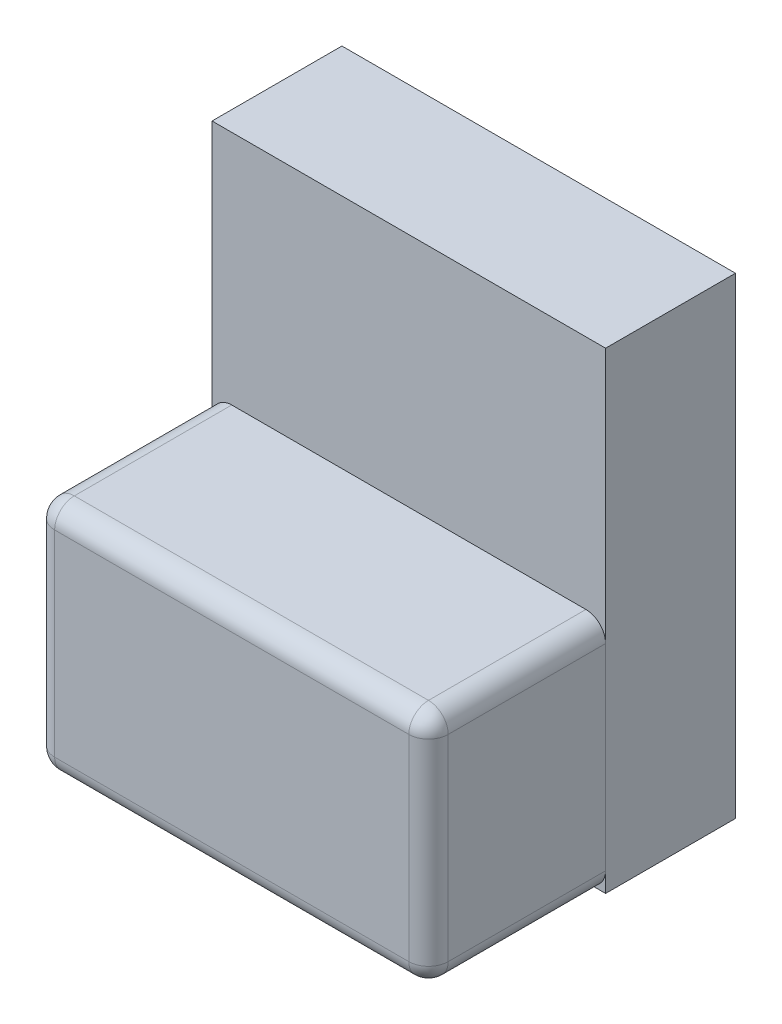
ISO-10303-21;
HEADER;
FILE_DESCRIPTION(('STEP AP214'),'2;1');
FILE_NAME('part.step','',(''),(''),'','','');
FILE_SCHEMA(('AUTOMOTIVE_DESIGN { 1 0 10303 214 1 1 1 1 }'));
ENDSEC;
DATA;
#1=APPLICATION_CONTEXT('core data for automotive mechanical design processes');
#2=APPLICATION_PROTOCOL_DEFINITION('international standard','automotive_design',2000,#1);
#3=PRODUCT_CONTEXT('',#1,'mechanical');
#4=PRODUCT('Part','Part','',(#3));
#5=PRODUCT_RELATED_PRODUCT_CATEGORY('part','',(#4));
#6=PRODUCT_DEFINITION_FORMATION('','',#4);
#7=PRODUCT_DEFINITION_CONTEXT('part definition',#1,'design');
#8=PRODUCT_DEFINITION('design','',#6,#7);
#9=PRODUCT_DEFINITION_SHAPE('','',#8);
#10=(LENGTH_UNIT() NAMED_UNIT(*) SI_UNIT(.MILLI.,.METRE.));
#11=(NAMED_UNIT(*) PLANE_ANGLE_UNIT() SI_UNIT($,.RADIAN.));
#12=(NAMED_UNIT(*) SI_UNIT($,.STERADIAN.) SOLID_ANGLE_UNIT());
#13=UNCERTAINTY_MEASURE_WITH_UNIT(LENGTH_MEASURE(1.E-05),#10,'distance_accuracy_value','');
#14=(GEOMETRIC_REPRESENTATION_CONTEXT(3) GLOBAL_UNCERTAINTY_ASSIGNED_CONTEXT((#13)) GLOBAL_UNIT_ASSIGNED_CONTEXT((#10,
#11,#12)) REPRESENTATION_CONTEXT('',''));
#15=CARTESIAN_POINT('',(0.,0.,0.));
#16=DIRECTION('',(0.,0.,1.));
#17=DIRECTION('',(1.,0.,0.));
#18=AXIS2_PLACEMENT_3D('',#15,#16,#17);
#19=CARTESIAN_POINT('',(0.,0.,0.));
#20=DIRECTION('',(0.,0.,1.));
#21=DIRECTION('',(1.,0.,0.));
#22=AXIS2_PLACEMENT_3D('',#19,#20,#21);
#23=PLANE('',#22);
#24=DIRECTION('',(0.,1.,0.));
#25=VECTOR('',#24,1.);
#26=CARTESIAN_POINT('',(0.5,0.6,0.));
#27=LINE('',#26,#25);
#28=CARTESIAN_POINT('',(0.5,-0.6,0.));
#29=VERTEX_POINT('',#28);
#30=CARTESIAN_POINT('',(0.5,0.6,0.));
#31=VERTEX_POINT('',#30);
#32=EDGE_CURVE('P0_E107',#29,#31,#27,.T.);
#33=ORIENTED_EDGE('',*,*,#32,.F.);
#34=DIRECTION('',(1.,0.,0.));
#35=VECTOR('',#34,1.);
#36=CARTESIAN_POINT('',(-0.5,-0.6,0.));
#37=LINE('',#36,#35);
#38=CARTESIAN_POINT('',(-0.5,-0.6,0.));
#39=VERTEX_POINT('',#38);
#40=EDGE_CURVE('P0_E28',#39,#29,#37,.T.);
#41=ORIENTED_EDGE('',*,*,#40,.F.);
#42=DIRECTION('',(0.,-1.,0.));
#43=VECTOR('',#42,1.);
#44=CARTESIAN_POINT('',(-0.5,0.6,0.));
#45=LINE('',#44,#43);
#46=CARTESIAN_POINT('',(-0.5,0.6,0.));
#47=VERTEX_POINT('',#46);
#48=EDGE_CURVE('P0_E78',#47,#39,#45,.T.);
#49=ORIENTED_EDGE('',*,*,#48,.F.);
#50=DIRECTION('',(-1.,0.,0.));
#51=VECTOR('',#50,1.);
#52=CARTESIAN_POINT('',(-0.5,0.6,0.));
#53=LINE('',#52,#51);
#54=EDGE_CURVE('P0_E82',#31,#47,#53,.T.);
#55=ORIENTED_EDGE('',*,*,#54,.F.);
#56=EDGE_LOOP('',(#33,#41,#49,#55));
#57=FACE_BOUND('',#56,.T.);
#58=ADVANCED_FACE('P0_F17',(#57),#23,.F.);
#59=CARTESIAN_POINT('',(0.,0.,0.33));
#60=DIRECTION('',(0.,0.,1.));
#61=DIRECTION('',(1.,0.,0.));
#62=AXIS2_PLACEMENT_3D('',#59,#60,#61);
#63=PLANE('',#62);
#64=DIRECTION('',(0.,1.,0.));
#65=VECTOR('',#64,1.);
#66=CARTESIAN_POINT('',(0.5,0.6,0.33));
#67=LINE('',#66,#65);
#68=CARTESIAN_POINT('',(0.5,-0.6,0.33));
#69=VERTEX_POINT('',#68);
#70=CARTESIAN_POINT('',(0.5,0.6,0.33));
#71=VERTEX_POINT('',#70);
#72=EDGE_CURVE('P0_E73',#69,#71,#67,.T.);
#73=ORIENTED_EDGE('',*,*,#72,.T.);
#74=DIRECTION('',(-1.,0.,0.));
#75=VECTOR('',#74,1.);
#76=CARTESIAN_POINT('',(-0.5,0.6,0.33));
#77=LINE('',#76,#75);
#78=CARTESIAN_POINT('',(-0.5,0.6,0.33));
#79=VERTEX_POINT('',#78);
#80=EDGE_CURVE('P0_E70',#71,#79,#77,.T.);
#81=ORIENTED_EDGE('',*,*,#80,.T.);
#82=DIRECTION('',(0.,-1.,0.));
#83=VECTOR('',#82,1.);
#84=CARTESIAN_POINT('',(-0.5,0.6,0.33));
#85=LINE('',#84,#83);
#86=CARTESIAN_POINT('',(-0.5,-0.6,0.33));
#87=VERTEX_POINT('',#86);
#88=EDGE_CURVE('P0_E21',#79,#87,#85,.T.);
#89=ORIENTED_EDGE('',*,*,#88,.T.);
#90=DIRECTION('',(1.,0.,0.));
#91=VECTOR('',#90,1.);
#92=CARTESIAN_POINT('',(-0.5,-0.6,0.33));
#93=LINE('',#92,#91);
#94=EDGE_CURVE('P0_E11',#87,#69,#93,.T.);
#95=ORIENTED_EDGE('',*,*,#94,.T.);
#96=EDGE_LOOP('',(#73,#81,#89,#95));
#97=FACE_BOUND('',#96,.T.);
#98=ADVANCED_FACE('P0_F71',(#97),#63,.T.);
#99=CARTESIAN_POINT('',(-0.5,-0.6,0.33));
#100=DIRECTION('',(0.,1.,0.));
#101=DIRECTION('',(1.,0.,0.));
#102=AXIS2_PLACEMENT_3D('',#99,#100,#101);
#103=PLANE('',#102);
#104=ORIENTED_EDGE('',*,*,#40,.T.);
#105=DIRECTION('',(0.,0.,-1.));
#106=VECTOR('',#105,1.);
#107=CARTESIAN_POINT('',(0.5,-0.6,0.33));
#108=LINE('',#107,#106);
#109=EDGE_CURVE('P0_E89',#69,#29,#108,.T.);
#110=ORIENTED_EDGE('',*,*,#109,.F.);
#111=ORIENTED_EDGE('',*,*,#94,.F.);
#112=DIRECTION('',(0.,0.,-1.));
#113=VECTOR('',#112,1.);
#114=CARTESIAN_POINT('',(-0.5,-0.6,0.33));
#115=LINE('',#114,#113);
#116=EDGE_CURVE('P0_E65',#87,#39,#115,.T.);
#117=ORIENTED_EDGE('',*,*,#116,.T.);
#118=EDGE_LOOP('',(#104,#110,#111,#117));
#119=FACE_BOUND('',#118,.T.);
#120=ADVANCED_FACE('P0_F19',(#119),#103,.F.);
#121=CARTESIAN_POINT('',(-0.5,0.6,0.33));
#122=DIRECTION('',(1.,0.,0.));
#123=DIRECTION('',(0.,1.,0.));
#124=AXIS2_PLACEMENT_3D('',#121,#122,#123);
#125=PLANE('',#124);
#126=ORIENTED_EDGE('',*,*,#48,.T.);
#127=ORIENTED_EDGE('',*,*,#116,.F.);
#128=ORIENTED_EDGE('',*,*,#88,.F.);
#129=DIRECTION('',(0.,0.,-1.));
#130=VECTOR('',#129,1.);
#131=CARTESIAN_POINT('',(-0.5,0.6,0.33));
#132=LINE('',#131,#130);
#133=EDGE_CURVE('P0_E63',#79,#47,#132,.T.);
#134=ORIENTED_EDGE('',*,*,#133,.T.);
#135=EDGE_LOOP('',(#126,#127,#128,#134));
#136=FACE_BOUND('',#135,.T.);
#137=ADVANCED_FACE('P0_F61',(#136),#125,.F.);
#138=CARTESIAN_POINT('',(-0.5,0.6,0.33));
#139=DIRECTION('',(0.,-1.,0.));
#140=DIRECTION('',(0.,0.,-1.));
#141=AXIS2_PLACEMENT_3D('',#138,#139,#140);
#142=PLANE('',#141);
#143=ORIENTED_EDGE('',*,*,#54,.T.);
#144=ORIENTED_EDGE('',*,*,#133,.F.);
#145=ORIENTED_EDGE('',*,*,#80,.F.);
#146=DIRECTION('',(0.,0.,-1.));
#147=VECTOR('',#146,1.);
#148=CARTESIAN_POINT('',(0.5,0.6,0.33));
#149=LINE('',#148,#147);
#150=EDGE_CURVE('P0_E132',#71,#31,#149,.T.);
#151=ORIENTED_EDGE('',*,*,#150,.T.);
#152=EDGE_LOOP('',(#143,#144,#145,#151));
#153=FACE_BOUND('',#152,.T.);
#154=ADVANCED_FACE('P0_F80',(#153),#142,.F.);
#155=CARTESIAN_POINT('',(0.5,0.6,0.33));
#156=DIRECTION('',(-1.,0.,0.));
#157=DIRECTION('',(0.,1.,0.));
#158=AXIS2_PLACEMENT_3D('',#155,#156,#157);
#159=PLANE('',#158);
#160=ORIENTED_EDGE('',*,*,#32,.T.);
#161=ORIENTED_EDGE('',*,*,#150,.F.);
#162=ORIENTED_EDGE('',*,*,#72,.F.);
#163=ORIENTED_EDGE('',*,*,#109,.T.);
#164=EDGE_LOOP('',(#160,#161,#162,#163));
#165=FACE_BOUND('',#164,.T.);
#166=ADVANCED_FACE('P0_F125',(#165),#159,.F.);
#167=CLOSED_SHELL('',(#58,#98,#120,#137,#154,#166));
#168=MANIFOLD_SOLID_BREP('P0_B1',#167);
#169=CARTESIAN_POINT('',(0.,-0.05,0.73));
#170=DIRECTION('',(-1.,0.,0.));
#171=DIRECTION('',(0.,0.,1.));
#172=AXIS2_PLACEMENT_3D('',#169,#170,#171);
#173=CYLINDRICAL_SURFACE('',#172,0.05);
#174=CARTESIAN_POINT('',(0.45,-0.05,0.73));
#175=DIRECTION('',(-1.,0.,0.));
#176=DIRECTION('',(0.,0.,-1.));
#177=AXIS2_PLACEMENT_3D('',#174,#175,#176);
#178=CIRCLE('',#177,0.05);
#179=CARTESIAN_POINT('',(0.45,-0.05,0.78));
#180=VERTEX_POINT('',#179);
#181=CARTESIAN_POINT('',(0.45,0.,0.73));
#182=VERTEX_POINT('',#181);
#183=EDGE_CURVE('P1_E20',#180,#182,#178,.T.);
#184=ORIENTED_EDGE('',*,*,#183,.T.);
#185=DIRECTION('',(1.,0.,0.));
#186=VECTOR('',#185,1.);
#187=CARTESIAN_POINT('',(-0.5,0.,0.73));
#188=LINE('',#187,#186);
#189=CARTESIAN_POINT('',(-0.45,0.,0.73));
#190=VERTEX_POINT('',#189);
#191=EDGE_CURVE('P1_E180',#190,#182,#188,.T.);
#192=ORIENTED_EDGE('',*,*,#191,.F.);
#193=CARTESIAN_POINT('',(-0.45,-0.05,0.73));
#194=DIRECTION('',(1.,0.,0.));
#195=DIRECTION('',(0.,0.,1.));
#196=AXIS2_PLACEMENT_3D('',#193,#194,#195);
#197=CIRCLE('',#196,0.05);
#198=CARTESIAN_POINT('',(-0.45,-0.05,0.78));
#199=VERTEX_POINT('',#198);
#200=EDGE_CURVE('P1_E11',#190,#199,#197,.T.);
#201=ORIENTED_EDGE('',*,*,#200,.T.);
#202=DIRECTION('',(-1.,0.,0.));
#203=VECTOR('',#202,1.);
#204=CARTESIAN_POINT('',(0.,-0.05,0.78));
#205=LINE('',#204,#203);
#206=EDGE_CURVE('P1_E221',#180,#199,#205,.T.);
#207=ORIENTED_EDGE('',*,*,#206,.F.);
#208=EDGE_LOOP('',(#184,#192,#201,#207));
#209=FACE_BOUND('',#208,.T.);
#210=ADVANCED_FACE('P1_F17',(#209),#173,.T.);
#211=CARTESIAN_POINT('',(-0.45,-0.05,0.73));
#212=DIRECTION('',(0.,1.,0.));
#213=DIRECTION('',(1.,0.,0.));
#214=AXIS2_PLACEMENT_3D('',#211,#212,#213);
#215=SPHERICAL_SURFACE('',#214,0.05);
#216=CARTESIAN_POINT('',(-0.45,-0.05,0.73));
#217=DIRECTION('',(0.,0.,1.));
#218=DIRECTION('',(1.,0.,0.));
#219=AXIS2_PLACEMENT_3D('',#216,#217,#218);
#220=CIRCLE('',#219,0.05);
#221=CARTESIAN_POINT('',(-0.5,-0.05,0.73));
#222=VERTEX_POINT('',#221);
#223=EDGE_CURVE('P1_E255',#190,#222,#220,.T.);
#224=ORIENTED_EDGE('',*,*,#223,.T.);
#225=CARTESIAN_POINT('',(-0.45,-0.05,0.73));
#226=DIRECTION('',(0.,1.,0.));
#227=DIRECTION('',(0.,0.,1.));
#228=AXIS2_PLACEMENT_3D('',#225,#226,#227);
#229=CIRCLE('',#228,0.05);
#230=EDGE_CURVE('P1_E154',#222,#199,#229,.T.);
#231=ORIENTED_EDGE('',*,*,#230,.T.);
#232=ORIENTED_EDGE('',*,*,#200,.F.);
#233=EDGE_LOOP('',(#224,#231,#232));
#234=FACE_BOUND('',#233,.T.);
#235=ADVANCED_FACE('P1_F324',(#234),#215,.T.);
#236=CARTESIAN_POINT('',(0.45,-0.05,0.73));
#237=DIRECTION('',(0.,1.,0.));
#238=DIRECTION('',(1.,0.,0.));
#239=AXIS2_PLACEMENT_3D('',#236,#237,#238);
#240=SPHERICAL_SURFACE('',#239,0.05);
#241=CARTESIAN_POINT('',(0.45,-0.05,0.73));
#242=DIRECTION('',(0.,1.,0.));
#243=DIRECTION('',(0.,0.,1.));
#244=AXIS2_PLACEMENT_3D('',#241,#242,#243);
#245=CIRCLE('',#244,0.05);
#246=CARTESIAN_POINT('',(0.5,-0.05,0.73));
#247=VERTEX_POINT('',#246);
#248=EDGE_CURVE('P1_E251',#180,#247,#245,.T.);
#249=ORIENTED_EDGE('',*,*,#248,.T.);
#250=CARTESIAN_POINT('',(0.45,-0.05,0.73));
#251=DIRECTION('',(0.,0.,1.));
#252=DIRECTION('',(1.,0.,0.));
#253=AXIS2_PLACEMENT_3D('',#250,#251,#252);
#254=CIRCLE('',#253,0.05);
#255=EDGE_CURVE('P1_E126',#247,#182,#254,.T.);
#256=ORIENTED_EDGE('',*,*,#255,.T.);
#257=ORIENTED_EDGE('',*,*,#183,.F.);
#258=EDGE_LOOP('',(#249,#256,#257));
#259=FACE_BOUND('',#258,.T.);
#260=ADVANCED_FACE('P1_F268',(#259),#240,.T.);
#261=CARTESIAN_POINT('',(-0.45,-0.05,0.78));
#262=DIRECTION('',(0.,0.,-1.));
#263=DIRECTION('',(-1.,0.,0.));
#264=AXIS2_PLACEMENT_3D('',#261,#262,#263);
#265=CYLINDRICAL_SURFACE('',#264,0.05);
#266=CARTESIAN_POINT('',(-0.45,-0.05,0.33));
#267=DIRECTION('',(0.,0.,-1.));
#268=DIRECTION('',(-1.,0.,0.));
#269=AXIS2_PLACEMENT_3D('',#266,#267,#268);
#270=CIRCLE('',#269,0.05);
#271=CARTESIAN_POINT('',(-0.5,-0.05,0.33));
#272=VERTEX_POINT('',#271);
#273=CARTESIAN_POINT('',(-0.45,0.,0.33));
#274=VERTEX_POINT('',#273);
#275=EDGE_CURVE('P1_E213',#272,#274,#270,.T.);
#276=ORIENTED_EDGE('',*,*,#275,.F.);
#277=DIRECTION('',(0.,0.,-1.));
#278=VECTOR('',#277,1.);
#279=CARTESIAN_POINT('',(-0.5,-0.05,0.78));
#280=LINE('',#279,#278);
#281=EDGE_CURVE('P1_E157',#222,#272,#280,.T.);
#282=ORIENTED_EDGE('',*,*,#281,.F.);
#283=ORIENTED_EDGE('',*,*,#223,.F.);
#284=DIRECTION('',(0.,0.,1.));
#285=VECTOR('',#284,1.);
#286=CARTESIAN_POINT('',(-0.45,0.,0.78));
#287=LINE('',#286,#285);
#288=EDGE_CURVE('P1_E176',#274,#190,#287,.T.);
#289=ORIENTED_EDGE('',*,*,#288,.F.);
#290=EDGE_LOOP('',(#276,#282,#283,#289));
#291=FACE_BOUND('',#290,.T.);
#292=ADVANCED_FACE('P1_F278',(#291),#265,.T.);
#293=CARTESIAN_POINT('',(-0.45,0.,0.73));
#294=DIRECTION('',(0.,-1.,0.));
#295=DIRECTION('',(0.,0.,-1.));
#296=AXIS2_PLACEMENT_3D('',#293,#294,#295);
#297=CYLINDRICAL_SURFACE('',#296,0.05);
#298=CARTESIAN_POINT('',(-0.45,-0.55,0.73));
#299=DIRECTION('',(0.,1.,0.));
#300=DIRECTION('',(0.,0.,-1.));
#301=AXIS2_PLACEMENT_3D('',#298,#299,#300);
#302=CIRCLE('',#301,0.05);
#303=CARTESIAN_POINT('',(-0.5,-0.55,0.73));
#304=VERTEX_POINT('',#303);
#305=CARTESIAN_POINT('',(-0.45,-0.55,0.78));
#306=VERTEX_POINT('',#305);
#307=EDGE_CURVE('P1_E38',#304,#306,#302,.T.);
#308=ORIENTED_EDGE('',*,*,#307,.T.);
#309=DIRECTION('',(0.,-1.,0.));
#310=VECTOR('',#309,1.);
#311=CARTESIAN_POINT('',(-0.45,0.,0.78));
#312=LINE('',#311,#310);
#313=EDGE_CURVE('P1_E224',#199,#306,#312,.T.);
#314=ORIENTED_EDGE('',*,*,#313,.F.);
#315=ORIENTED_EDGE('',*,*,#230,.F.);
#316=DIRECTION('',(0.,1.,0.));
#317=VECTOR('',#316,1.);
#318=CARTESIAN_POINT('',(-0.5,-0.6,0.73));
#319=LINE('',#318,#317);
#320=EDGE_CURVE('P1_E146',#304,#222,#319,.T.);
#321=ORIENTED_EDGE('',*,*,#320,.F.);
#322=EDGE_LOOP('',(#308,#314,#315,#321));
#323=FACE_BOUND('',#322,.T.);
#324=ADVANCED_FACE('P1_F153',(#323),#297,.T.);
#325=CARTESIAN_POINT('',(0.45,0.,0.73));
#326=DIRECTION('',(0.,1.,0.));
#327=DIRECTION('',(0.,0.,1.));
#328=AXIS2_PLACEMENT_3D('',#325,#326,#327);
#329=CYLINDRICAL_SURFACE('',#328,0.05);
#330=CARTESIAN_POINT('',(0.45,-0.55,0.73));
#331=DIRECTION('',(0.,1.,0.));
#332=DIRECTION('',(0.,0.,-1.));
#333=AXIS2_PLACEMENT_3D('',#330,#331,#332);
#334=CIRCLE('',#333,0.05);
#335=CARTESIAN_POINT('',(0.45,-0.55,0.78));
#336=VERTEX_POINT('',#335);
#337=CARTESIAN_POINT('',(0.5,-0.55,0.73));
#338=VERTEX_POINT('',#337);
#339=EDGE_CURVE('P1_E127',#336,#338,#334,.T.);
#340=ORIENTED_EDGE('',*,*,#339,.T.);
#341=DIRECTION('',(0.,-1.,0.));
#342=VECTOR('',#341,1.);
#343=CARTESIAN_POINT('',(0.5,-0.6,0.73));
#344=LINE('',#343,#342);
#345=EDGE_CURVE('P1_E173',#247,#338,#344,.T.);
#346=ORIENTED_EDGE('',*,*,#345,.F.);
#347=ORIENTED_EDGE('',*,*,#248,.F.);
#348=DIRECTION('',(0.,1.,0.));
#349=VECTOR('',#348,1.);
#350=CARTESIAN_POINT('',(0.45,0.,0.78));
#351=LINE('',#350,#349);
#352=EDGE_CURVE('P1_E217',#336,#180,#351,.T.);
#353=ORIENTED_EDGE('',*,*,#352,.F.);
#354=EDGE_LOOP('',(#340,#346,#347,#353));
#355=FACE_BOUND('',#354,.T.);
#356=ADVANCED_FACE('P1_F344',(#355),#329,.T.);
#357=CARTESIAN_POINT('',(0.45,-0.05,0.78));
#358=DIRECTION('',(0.,0.,-1.));
#359=DIRECTION('',(-1.,0.,0.));
#360=AXIS2_PLACEMENT_3D('',#357,#358,#359);
#361=CYLINDRICAL_SURFACE('',#360,0.05);
#362=CARTESIAN_POINT('',(0.45,-0.05,0.33));
#363=DIRECTION('',(0.,0.,-1.));
#364=DIRECTION('',(-1.,0.,0.));
#365=AXIS2_PLACEMENT_3D('',#362,#363,#364);
#366=CIRCLE('',#365,0.05);
#367=CARTESIAN_POINT('',(0.45,0.,0.33));
#368=VERTEX_POINT('',#367);
#369=CARTESIAN_POINT('',(0.5,-0.05,0.33));
#370=VERTEX_POINT('',#369);
#371=EDGE_CURVE('P1_E209',#368,#370,#366,.T.);
#372=ORIENTED_EDGE('',*,*,#371,.F.);
#373=DIRECTION('',(0.,0.,-1.));
#374=VECTOR('',#373,1.);
#375=CARTESIAN_POINT('',(0.45,0.,0.78));
#376=LINE('',#375,#374);
#377=EDGE_CURVE('P1_E208',#182,#368,#376,.T.);
#378=ORIENTED_EDGE('',*,*,#377,.F.);
#379=ORIENTED_EDGE('',*,*,#255,.F.);
#380=DIRECTION('',(0.,0.,1.));
#381=VECTOR('',#380,1.);
#382=CARTESIAN_POINT('',(0.5,-0.05,0.78));
#383=LINE('',#382,#381);
#384=EDGE_CURVE('P1_E170',#370,#247,#383,.T.);
#385=ORIENTED_EDGE('',*,*,#384,.F.);
#386=EDGE_LOOP('',(#372,#378,#379,#385));
#387=FACE_BOUND('',#386,.T.);
#388=ADVANCED_FACE('P1_F272',(#387),#361,.T.);
#389=CARTESIAN_POINT('',(-0.45,-0.55,0.73));
#390=DIRECTION('',(0.,1.,0.));
#391=DIRECTION('',(1.,0.,0.));
#392=AXIS2_PLACEMENT_3D('',#389,#390,#391);
#393=SPHERICAL_SURFACE('',#392,0.05);
#394=CARTESIAN_POINT('',(-0.45,-0.55,0.73));
#395=DIRECTION('',(0.,0.,1.));
#396=DIRECTION('',(1.,0.,0.));
#397=AXIS2_PLACEMENT_3D('',#394,#395,#396);
#398=CIRCLE('',#397,0.05);
#399=CARTESIAN_POINT('',(-0.45,-0.6,0.73));
#400=VERTEX_POINT('',#399);
#401=EDGE_CURVE('P1_E121',#304,#400,#398,.T.);
#402=ORIENTED_EDGE('',*,*,#401,.T.);
#403=CARTESIAN_POINT('',(-0.45,-0.55,0.73));
#404=DIRECTION('',(-1.,0.,0.));
#405=DIRECTION('',(0.,0.,1.));
#406=AXIS2_PLACEMENT_3D('',#403,#404,#405);
#407=CIRCLE('',#406,0.05);
#408=EDGE_CURVE('P1_E123',#400,#306,#407,.T.);
#409=ORIENTED_EDGE('',*,*,#408,.T.);
#410=ORIENTED_EDGE('',*,*,#307,.F.);
#411=EDGE_LOOP('',(#402,#409,#410));
#412=FACE_BOUND('',#411,.T.);
#413=ADVANCED_FACE('P1_F120',(#412),#393,.T.);
#414=CARTESIAN_POINT('',(0.45,-0.55,0.73));
#415=DIRECTION('',(0.,1.,0.));
#416=DIRECTION('',(1.,0.,0.));
#417=AXIS2_PLACEMENT_3D('',#414,#415,#416);
#418=SPHERICAL_SURFACE('',#417,0.05);
#419=CARTESIAN_POINT('',(0.45,-0.55,0.73));
#420=DIRECTION('',(1.,0.,0.));
#421=DIRECTION('',(0.,0.,-1.));
#422=AXIS2_PLACEMENT_3D('',#419,#420,#421);
#423=CIRCLE('',#422,0.05);
#424=CARTESIAN_POINT('',(0.45,-0.6,0.73));
#425=VERTEX_POINT('',#424);
#426=EDGE_CURVE('P1_E140',#336,#425,#423,.T.);
#427=ORIENTED_EDGE('',*,*,#426,.T.);
#428=CARTESIAN_POINT('',(0.45,-0.55,0.73));
#429=DIRECTION('',(0.,0.,1.));
#430=DIRECTION('',(1.,0.,0.));
#431=AXIS2_PLACEMENT_3D('',#428,#429,#430);
#432=CIRCLE('',#431,0.05);
#433=EDGE_CURVE('P1_E240',#425,#338,#432,.T.);
#434=ORIENTED_EDGE('',*,*,#433,.T.);
#435=ORIENTED_EDGE('',*,*,#339,.F.);
#436=EDGE_LOOP('',(#427,#434,#435));
#437=FACE_BOUND('',#436,.T.);
#438=ADVANCED_FACE('P1_F349',(#437),#418,.T.);
#439=CARTESIAN_POINT('',(-0.45,-0.55,0.78));
#440=DIRECTION('',(0.,0.,-1.));
#441=DIRECTION('',(-1.,0.,0.));
#442=AXIS2_PLACEMENT_3D('',#439,#440,#441);
#443=CYLINDRICAL_SURFACE('',#442,0.05);
#444=CARTESIAN_POINT('',(-0.45,-0.55,0.33));
#445=DIRECTION('',(0.,0.,-1.));
#446=DIRECTION('',(-1.,0.,0.));
#447=AXIS2_PLACEMENT_3D('',#444,#445,#446);
#448=CIRCLE('',#447,0.05);
#449=CARTESIAN_POINT('',(-0.45,-0.6,0.33));
#450=VERTEX_POINT('',#449);
#451=CARTESIAN_POINT('',(-0.5,-0.55,0.33));
#452=VERTEX_POINT('',#451);
#453=EDGE_CURVE('P1_E237',#450,#452,#448,.T.);
#454=ORIENTED_EDGE('',*,*,#453,.F.);
#455=DIRECTION('',(0.,0.,-1.));
#456=VECTOR('',#455,1.);
#457=CARTESIAN_POINT('',(-0.45,-0.6,0.78));
#458=LINE('',#457,#456);
#459=EDGE_CURVE('P1_E137',#400,#450,#458,.T.);
#460=ORIENTED_EDGE('',*,*,#459,.F.);
#461=ORIENTED_EDGE('',*,*,#401,.F.);
#462=DIRECTION('',(0.,0.,1.));
#463=VECTOR('',#462,1.);
#464=CARTESIAN_POINT('',(-0.5,-0.55,0.78));
#465=LINE('',#464,#463);
#466=EDGE_CURVE('P1_E134',#452,#304,#465,.T.);
#467=ORIENTED_EDGE('',*,*,#466,.F.);
#468=EDGE_LOOP('',(#454,#460,#461,#467));
#469=FACE_BOUND('',#468,.T.);
#470=ADVANCED_FACE('P1_F133',(#469),#443,.T.);
#471=CARTESIAN_POINT('',(0.,-0.55,0.73));
#472=DIRECTION('',(1.,0.,0.));
#473=DIRECTION('',(0.,0.,-1.));
#474=AXIS2_PLACEMENT_3D('',#471,#472,#473);
#475=CYLINDRICAL_SURFACE('',#474,0.05);
#476=ORIENTED_EDGE('',*,*,#408,.F.);
#477=DIRECTION('',(-1.,0.,0.));
#478=VECTOR('',#477,1.);
#479=CARTESIAN_POINT('',(-0.5,-0.6,0.73));
#480=LINE('',#479,#478);
#481=EDGE_CURVE('P1_E189',#425,#400,#480,.T.);
#482=ORIENTED_EDGE('',*,*,#481,.F.);
#483=ORIENTED_EDGE('',*,*,#426,.F.);
#484=DIRECTION('',(1.,0.,0.));
#485=VECTOR('',#484,1.);
#486=CARTESIAN_POINT('',(0.,-0.55,0.78));
#487=LINE('',#486,#485);
#488=EDGE_CURVE('P1_E229',#306,#336,#487,.T.);
#489=ORIENTED_EDGE('',*,*,#488,.F.);
#490=EDGE_LOOP('',(#476,#482,#483,#489));
#491=FACE_BOUND('',#490,.T.);
#492=ADVANCED_FACE('P1_F369',(#491),#475,.T.);
#493=CARTESIAN_POINT('',(0.45,-0.55,0.78));
#494=DIRECTION('',(0.,0.,-1.));
#495=DIRECTION('',(-1.,0.,0.));
#496=AXIS2_PLACEMENT_3D('',#493,#494,#495);
#497=CYLINDRICAL_SURFACE('',#496,0.05);
#498=CARTESIAN_POINT('',(0.45,-0.55,0.33));
#499=DIRECTION('',(0.,0.,-1.));
#500=DIRECTION('',(-1.,0.,0.));
#501=AXIS2_PLACEMENT_3D('',#498,#499,#500);
#502=CIRCLE('',#501,0.05);
#503=CARTESIAN_POINT('',(0.5,-0.55,0.33));
#504=VERTEX_POINT('',#503);
#505=CARTESIAN_POINT('',(0.45,-0.6,0.33));
#506=VERTEX_POINT('',#505);
#507=EDGE_CURVE('P1_E212',#504,#506,#502,.T.);
#508=ORIENTED_EDGE('',*,*,#507,.F.);
#509=DIRECTION('',(0.,0.,-1.));
#510=VECTOR('',#509,1.);
#511=CARTESIAN_POINT('',(0.5,-0.55,0.78));
#512=LINE('',#511,#510);
#513=EDGE_CURVE('P1_E192',#338,#504,#512,.T.);
#514=ORIENTED_EDGE('',*,*,#513,.F.);
#515=ORIENTED_EDGE('',*,*,#433,.F.);
#516=DIRECTION('',(0.,0.,1.));
#517=VECTOR('',#516,1.);
#518=CARTESIAN_POINT('',(0.45,-0.6,0.78));
#519=LINE('',#518,#517);
#520=EDGE_CURVE('P1_E185',#506,#425,#519,.T.);
#521=ORIENTED_EDGE('',*,*,#520,.F.);
#522=EDGE_LOOP('',(#508,#514,#515,#521));
#523=FACE_BOUND('',#522,.T.);
#524=ADVANCED_FACE('P1_F384',(#523),#497,.T.);
#525=CARTESIAN_POINT('',(0.,0.,0.33));
#526=DIRECTION('',(0.,0.,-1.));
#527=DIRECTION('',(0.,-1.,0.));
#528=AXIS2_PLACEMENT_3D('',#525,#526,#527);
#529=PLANE('',#528);
#530=DIRECTION('',(0.,-1.,0.));
#531=VECTOR('',#530,1.);
#532=CARTESIAN_POINT('',(-0.5,-0.6,0.33));
#533=LINE('',#532,#531);
#534=EDGE_CURVE('P1_E148',#272,#452,#533,.T.);
#535=ORIENTED_EDGE('',*,*,#534,.F.);
#536=ORIENTED_EDGE('',*,*,#275,.T.);
#537=DIRECTION('',(-1.,0.,0.));
#538=VECTOR('',#537,1.);
#539=CARTESIAN_POINT('',(-0.5,0.,0.33));
#540=LINE('',#539,#538);
#541=EDGE_CURVE('P1_E181',#368,#274,#540,.T.);
#542=ORIENTED_EDGE('',*,*,#541,.F.);
#543=ORIENTED_EDGE('',*,*,#371,.T.);
#544=DIRECTION('',(0.,1.,0.));
#545=VECTOR('',#544,1.);
#546=CARTESIAN_POINT('',(0.5,-0.6,0.33));
#547=LINE('',#546,#545);
#548=EDGE_CURVE('P1_E174',#504,#370,#547,.T.);
#549=ORIENTED_EDGE('',*,*,#548,.F.);
#550=ORIENTED_EDGE('',*,*,#507,.T.);
#551=DIRECTION('',(1.,0.,0.));
#552=VECTOR('',#551,1.);
#553=CARTESIAN_POINT('',(-0.5,-0.6,0.33));
#554=LINE('',#553,#552);
#555=EDGE_CURVE('P1_E150',#450,#506,#554,.T.);
#556=ORIENTED_EDGE('',*,*,#555,.F.);
#557=ORIENTED_EDGE('',*,*,#453,.T.);
#558=EDGE_LOOP('',(#535,#536,#542,#543,#549,#550,#556,#557));
#559=FACE_BOUND('',#558,.T.);
#560=ADVANCED_FACE('P1_F280',(#559),#529,.T.);
#561=CARTESIAN_POINT('',(0.,0.,0.78));
#562=DIRECTION('',(0.,0.,-1.));
#563=DIRECTION('',(0.,-1.,0.));
#564=AXIS2_PLACEMENT_3D('',#561,#562,#563);
#565=PLANE('',#564);
#566=ORIENTED_EDGE('',*,*,#352,.T.);
#567=ORIENTED_EDGE('',*,*,#206,.T.);
#568=ORIENTED_EDGE('',*,*,#313,.T.);
#569=ORIENTED_EDGE('',*,*,#488,.T.);
#570=EDGE_LOOP('',(#566,#567,#568,#569));
#571=FACE_BOUND('',#570,.T.);
#572=ADVANCED_FACE('P1_F393',(#571),#565,.F.);
#573=CARTESIAN_POINT('',(-0.5,0.,0.78));
#574=DIRECTION('',(0.,-1.,0.));
#575=DIRECTION('',(0.,0.,-1.));
#576=AXIS2_PLACEMENT_3D('',#573,#574,#575);
#577=PLANE('',#576);
#578=ORIENTED_EDGE('',*,*,#541,.T.);
#579=ORIENTED_EDGE('',*,*,#288,.T.);
#580=ORIENTED_EDGE('',*,*,#191,.T.);
#581=ORIENTED_EDGE('',*,*,#377,.T.);
#582=EDGE_LOOP('',(#578,#579,#580,#581));
#583=FACE_BOUND('',#582,.T.);
#584=ADVANCED_FACE('P1_F275',(#583),#577,.F.);
#585=CARTESIAN_POINT('',(0.5,-0.6,0.78));
#586=DIRECTION('',(-1.,0.,0.));
#587=DIRECTION('',(0.,0.,1.));
#588=AXIS2_PLACEMENT_3D('',#585,#586,#587);
#589=PLANE('',#588);
#590=ORIENTED_EDGE('',*,*,#548,.T.);
#591=ORIENTED_EDGE('',*,*,#384,.T.);
#592=ORIENTED_EDGE('',*,*,#345,.T.);
#593=ORIENTED_EDGE('',*,*,#513,.T.);
#594=EDGE_LOOP('',(#590,#591,#592,#593));
#595=FACE_BOUND('',#594,.T.);
#596=ADVANCED_FACE('P1_F413',(#595),#589,.F.);
#597=CARTESIAN_POINT('',(-0.5,-0.6,0.78));
#598=DIRECTION('',(0.,1.,0.));
#599=DIRECTION('',(1.,0.,0.));
#600=AXIS2_PLACEMENT_3D('',#597,#598,#599);
#601=PLANE('',#600);
#602=ORIENTED_EDGE('',*,*,#555,.T.);
#603=ORIENTED_EDGE('',*,*,#520,.T.);
#604=ORIENTED_EDGE('',*,*,#481,.T.);
#605=ORIENTED_EDGE('',*,*,#459,.T.);
#606=EDGE_LOOP('',(#602,#603,#604,#605));
#607=FACE_BOUND('',#606,.T.);
#608=ADVANCED_FACE('P1_F283',(#607),#601,.F.);
#609=CARTESIAN_POINT('',(-0.5,-0.6,0.78));
#610=DIRECTION('',(1.,0.,0.));
#611=DIRECTION('',(0.,1.,0.));
#612=AXIS2_PLACEMENT_3D('',#609,#610,#611);
#613=PLANE('',#612);
#614=ORIENTED_EDGE('',*,*,#320,.T.);
#615=ORIENTED_EDGE('',*,*,#281,.T.);
#616=ORIENTED_EDGE('',*,*,#534,.T.);
#617=ORIENTED_EDGE('',*,*,#466,.T.);
#618=EDGE_LOOP('',(#614,#615,#616,#617));
#619=FACE_BOUND('',#618,.T.);
#620=ADVANCED_FACE('P1_F144',(#619),#613,.F.);
#621=CLOSED_SHELL('',(#210,#235,#260,#292,#324,#356,#388,#413,#438,#470,#492,#524,#560,#572,
#584,#596,#608,#620));
#622=MANIFOLD_SOLID_BREP('P1_B1',#621);
#623=ADVANCED_BREP_SHAPE_REPRESENTATION('',(#18,#168,#622),#14);
#624=SHAPE_DEFINITION_REPRESENTATION(#9,#623);
ENDSEC;
END-ISO-10303-21;
